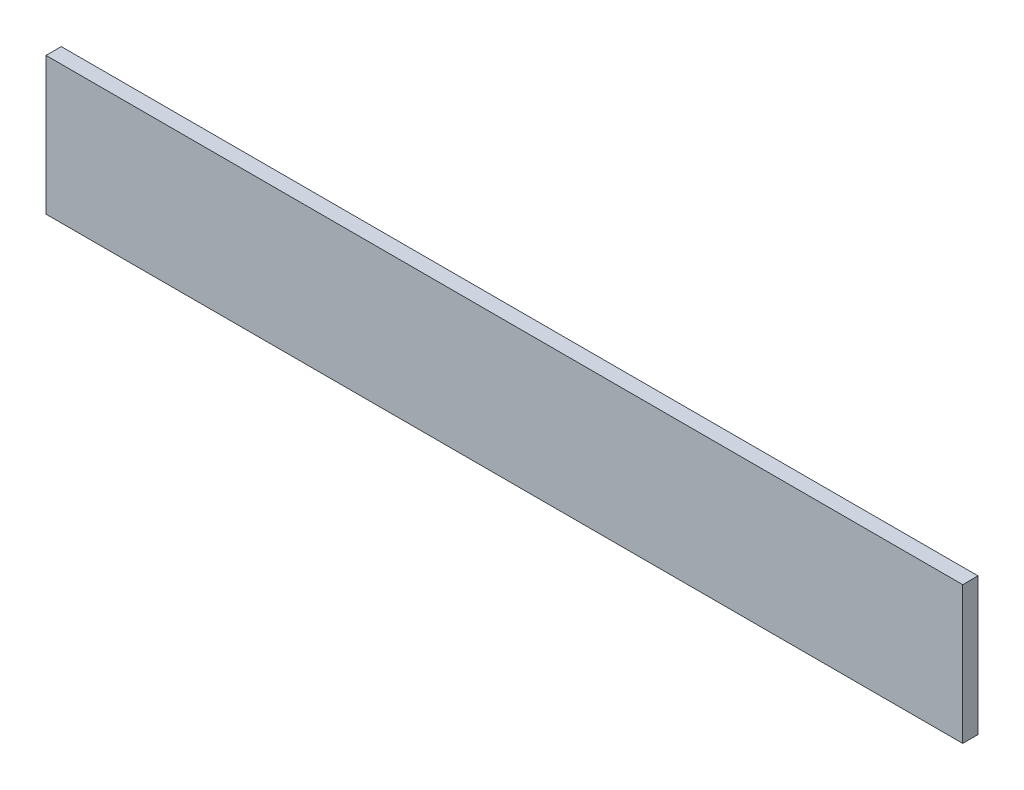
ISO-10303-21;
HEADER;
FILE_DESCRIPTION(('STEP AP214'),'2;1');
FILE_NAME('part.step','',(''),(''),'','','');
FILE_SCHEMA(('AUTOMOTIVE_DESIGN { 1 0 10303 214 1 1 1 1 }'));
ENDSEC;
DATA;
#1=APPLICATION_CONTEXT('core data for automotive mechanical design processes');
#2=APPLICATION_PROTOCOL_DEFINITION('international standard','automotive_design',2000,#1);
#3=PRODUCT_CONTEXT('',#1,'mechanical');
#4=PRODUCT('Part','Part','',(#3));
#5=PRODUCT_RELATED_PRODUCT_CATEGORY('part','',(#4));
#6=PRODUCT_DEFINITION_FORMATION('','',#4);
#7=PRODUCT_DEFINITION_CONTEXT('part definition',#1,'design');
#8=PRODUCT_DEFINITION('design','',#6,#7);
#9=PRODUCT_DEFINITION_SHAPE('','',#8);
#10=(LENGTH_UNIT() NAMED_UNIT(*) SI_UNIT(.MILLI.,.METRE.));
#11=(NAMED_UNIT(*) PLANE_ANGLE_UNIT() SI_UNIT($,.RADIAN.));
#12=(NAMED_UNIT(*) SI_UNIT($,.STERADIAN.) SOLID_ANGLE_UNIT());
#13=UNCERTAINTY_MEASURE_WITH_UNIT(LENGTH_MEASURE(1.E-05),#10,'distance_accuracy_value','');
#14=(GEOMETRIC_REPRESENTATION_CONTEXT(3) GLOBAL_UNCERTAINTY_ASSIGNED_CONTEXT((#13)) GLOBAL_UNIT_ASSIGNED_CONTEXT((#10,
#11,#12)) REPRESENTATION_CONTEXT('',''));
#15=CARTESIAN_POINT('',(0.,0.,0.));
#16=DIRECTION('',(0.,0.,1.));
#17=DIRECTION('',(1.,0.,0.));
#18=AXIS2_PLACEMENT_3D('',#15,#16,#17);
#19=CARTESIAN_POINT('',(0.,0.,5.));
#20=DIRECTION('',(1.,0.,0.));
#21=DIRECTION('',(0.,1.,0.));
#22=AXIS2_PLACEMENT_3D('',#19,#20,#21);
#23=PLANE('',#22);
#24=DIRECTION('',(0.,-1.,0.));
#25=VECTOR('',#24,1.);
#26=CARTESIAN_POINT('',(0.,0.,0.));
#27=LINE('',#26,#25);
#28=CARTESIAN_POINT('',(0.,0.,0.));
#29=VERTEX_POINT('',#28);
#30=CARTESIAN_POINT('',(0.,-45.,0.));
#31=VERTEX_POINT('',#30);
#32=EDGE_CURVE('E96',#29,#31,#27,.T.);
#33=ORIENTED_EDGE('',*,*,#32,.T.);
#34=DIRECTION('',(0.,0.,-1.));
#35=VECTOR('',#34,1.);
#36=CARTESIAN_POINT('',(0.,-45.,5.));
#37=LINE('',#36,#35);
#38=CARTESIAN_POINT('',(0.,-45.,5.));
#39=VERTEX_POINT('',#38);
#40=EDGE_CURVE('E11',#39,#31,#37,.T.);
#41=ORIENTED_EDGE('',*,*,#40,.F.);
#42=DIRECTION('',(0.,-1.,0.));
#43=VECTOR('',#42,1.);
#44=CARTESIAN_POINT('',(0.,0.,5.));
#45=LINE('',#44,#43);
#46=CARTESIAN_POINT('',(0.,0.,5.));
#47=VERTEX_POINT('',#46);
#48=EDGE_CURVE('E84',#47,#39,#45,.T.);
#49=ORIENTED_EDGE('',*,*,#48,.F.);
#50=DIRECTION('',(0.,0.,-1.));
#51=VECTOR('',#50,1.);
#52=CARTESIAN_POINT('',(0.,0.,5.));
#53=LINE('',#52,#51);
#54=EDGE_CURVE('E92',#47,#29,#53,.T.);
#55=ORIENTED_EDGE('',*,*,#54,.T.);
#56=EDGE_LOOP('',(#33,#41,#49,#55));
#57=FACE_BOUND('',#56,.T.);
#58=ADVANCED_FACE('F33',(#57),#23,.F.);
#59=CARTESIAN_POINT('',(0.,-45.,5.));
#60=DIRECTION('',(0.,1.,0.));
#61=DIRECTION('',(0.,0.,1.));
#62=AXIS2_PLACEMENT_3D('',#59,#60,#61);
#63=PLANE('',#62);
#64=DIRECTION('',(1.,0.,0.));
#65=VECTOR('',#64,1.);
#66=CARTESIAN_POINT('',(0.,-45.,0.));
#67=LINE('',#66,#65);
#68=CARTESIAN_POINT('',(300.,-45.,0.));
#69=VERTEX_POINT('',#68);
#70=EDGE_CURVE('E88',#31,#69,#67,.T.);
#71=ORIENTED_EDGE('',*,*,#70,.T.);
#72=DIRECTION('',(0.,0.,-1.));
#73=VECTOR('',#72,1.);
#74=CARTESIAN_POINT('',(300.,-45.,5.));
#75=LINE('',#74,#73);
#76=CARTESIAN_POINT('',(300.,-45.,5.));
#77=VERTEX_POINT('',#76);
#78=EDGE_CURVE('E41',#77,#69,#75,.T.);
#79=ORIENTED_EDGE('',*,*,#78,.F.);
#80=DIRECTION('',(1.,0.,0.));
#81=VECTOR('',#80,1.);
#82=CARTESIAN_POINT('',(0.,-45.,5.));
#83=LINE('',#82,#81);
#84=EDGE_CURVE('E79',#39,#77,#83,.T.);
#85=ORIENTED_EDGE('',*,*,#84,.F.);
#86=ORIENTED_EDGE('',*,*,#40,.T.);
#87=EDGE_LOOP('',(#71,#79,#85,#86));
#88=FACE_BOUND('',#87,.T.);
#89=ADVANCED_FACE('F87',(#88),#63,.F.);
#90=CARTESIAN_POINT('',(300.,0.,5.));
#91=DIRECTION('',(-1.,0.,0.));
#92=DIRECTION('',(0.,0.,1.));
#93=AXIS2_PLACEMENT_3D('',#90,#91,#92);
#94=PLANE('',#93);
#95=DIRECTION('',(0.,1.,0.));
#96=VECTOR('',#95,1.);
#97=CARTESIAN_POINT('',(300.,0.,0.));
#98=LINE('',#97,#96);
#99=CARTESIAN_POINT('',(300.,0.,0.));
#100=VERTEX_POINT('',#99);
#101=EDGE_CURVE('E66',#69,#100,#98,.T.);
#102=ORIENTED_EDGE('',*,*,#101,.T.);
#103=DIRECTION('',(0.,0.,-1.));
#104=VECTOR('',#103,1.);
#105=CARTESIAN_POINT('',(300.,0.,5.));
#106=LINE('',#105,#104);
#107=CARTESIAN_POINT('',(300.,0.,5.));
#108=VERTEX_POINT('',#107);
#109=EDGE_CURVE('E89',#108,#100,#106,.T.);
#110=ORIENTED_EDGE('',*,*,#109,.F.);
#111=DIRECTION('',(0.,1.,0.));
#112=VECTOR('',#111,1.);
#113=CARTESIAN_POINT('',(300.,0.,5.));
#114=LINE('',#113,#112);
#115=EDGE_CURVE('E82',#77,#108,#114,.T.);
#116=ORIENTED_EDGE('',*,*,#115,.F.);
#117=ORIENTED_EDGE('',*,*,#78,.T.);
#118=EDGE_LOOP('',(#102,#110,#116,#117));
#119=FACE_BOUND('',#118,.T.);
#120=ADVANCED_FACE('F90',(#119),#94,.F.);
#121=CARTESIAN_POINT('',(0.,0.,5.));
#122=DIRECTION('',(0.,-1.,0.));
#123=DIRECTION('',(0.,0.,-1.));
#124=AXIS2_PLACEMENT_3D('',#121,#122,#123);
#125=PLANE('',#124);
#126=DIRECTION('',(-1.,0.,0.));
#127=VECTOR('',#126,1.);
#128=CARTESIAN_POINT('',(0.,0.,0.));
#129=LINE('',#128,#127);
#130=EDGE_CURVE('E72',#100,#29,#129,.T.);
#131=ORIENTED_EDGE('',*,*,#130,.T.);
#132=ORIENTED_EDGE('',*,*,#54,.F.);
#133=DIRECTION('',(-1.,0.,0.));
#134=VECTOR('',#133,1.);
#135=CARTESIAN_POINT('',(0.,0.,5.));
#136=LINE('',#135,#134);
#137=EDGE_CURVE('E49',#108,#47,#136,.T.);
#138=ORIENTED_EDGE('',*,*,#137,.F.);
#139=ORIENTED_EDGE('',*,*,#109,.T.);
#140=EDGE_LOOP('',(#131,#132,#138,#139));
#141=FACE_BOUND('',#140,.T.);
#142=ADVANCED_FACE('F103',(#141),#125,.F.);
#143=CARTESIAN_POINT('',(0.,0.,5.));
#144=DIRECTION('',(0.,0.,1.));
#145=DIRECTION('',(1.,0.,0.));
#146=AXIS2_PLACEMENT_3D('',#143,#144,#145);
#147=PLANE('',#146);
#148=ORIENTED_EDGE('',*,*,#48,.T.);
#149=ORIENTED_EDGE('',*,*,#84,.T.);
#150=ORIENTED_EDGE('',*,*,#115,.T.);
#151=ORIENTED_EDGE('',*,*,#137,.T.);
#152=EDGE_LOOP('',(#148,#149,#150,#151));
#153=FACE_BOUND('',#152,.T.);
#154=ADVANCED_FACE('F80',(#153),#147,.T.);
#155=CARTESIAN_POINT('',(0.,0.,0.));
#156=DIRECTION('',(0.,0.,1.));
#157=DIRECTION('',(1.,0.,0.));
#158=AXIS2_PLACEMENT_3D('',#155,#156,#157);
#159=PLANE('',#158);
#160=ORIENTED_EDGE('',*,*,#32,.F.);
#161=ORIENTED_EDGE('',*,*,#130,.F.);
#162=ORIENTED_EDGE('',*,*,#101,.F.);
#163=ORIENTED_EDGE('',*,*,#70,.F.);
#164=EDGE_LOOP('',(#160,#161,#162,#163));
#165=FACE_BOUND('',#164,.T.);
#166=ADVANCED_FACE('F106',(#165),#159,.F.);
#167=CLOSED_SHELL('',(#58,#89,#120,#142,#154,#166));
#168=MANIFOLD_SOLID_BREP('B2',#167);
#169=ADVANCED_BREP_SHAPE_REPRESENTATION('',(#18,#168),#14);
#170=SHAPE_DEFINITION_REPRESENTATION(#9,#169);
ENDSEC;
END-ISO-10303-21;
